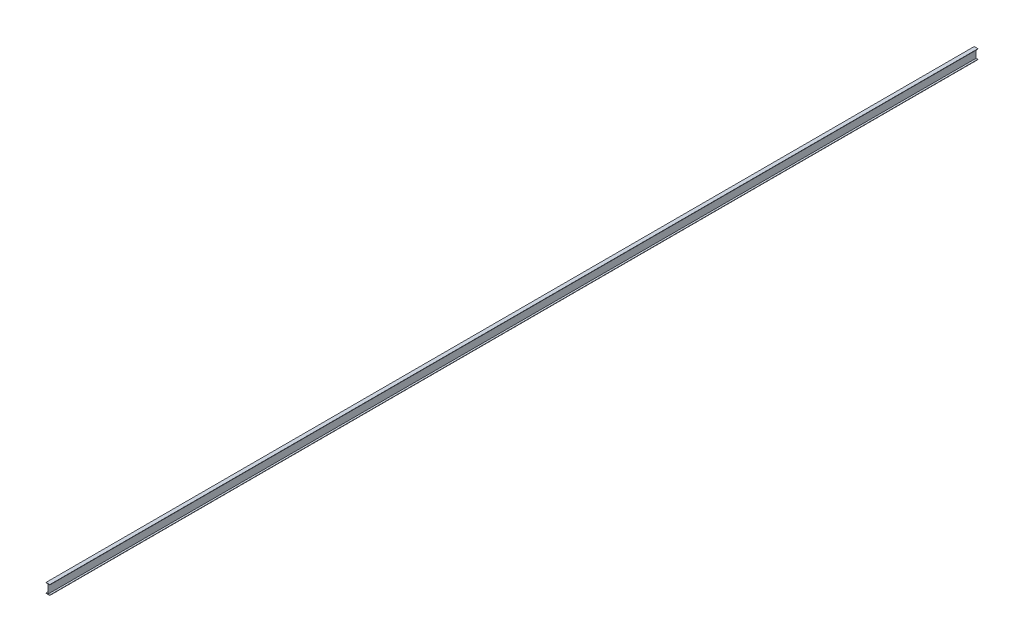
ISO-10303-21;
HEADER;
FILE_DESCRIPTION(('STEP AP214'),'2;1');
FILE_NAME('part.step','',(''),(''),'','','');
FILE_SCHEMA(('AUTOMOTIVE_DESIGN { 1 0 10303 214 1 1 1 1 }'));
ENDSEC;
DATA;
#1=APPLICATION_CONTEXT('core data for automotive mechanical design processes');
#2=APPLICATION_PROTOCOL_DEFINITION('international standard','automotive_design',2000,#1);
#3=PRODUCT_CONTEXT('',#1,'mechanical');
#4=PRODUCT('Part','Part','',(#3));
#5=PRODUCT_RELATED_PRODUCT_CATEGORY('part','',(#4));
#6=PRODUCT_DEFINITION_FORMATION('','',#4);
#7=PRODUCT_DEFINITION_CONTEXT('part definition',#1,'design');
#8=PRODUCT_DEFINITION('design','',#6,#7);
#9=PRODUCT_DEFINITION_SHAPE('','',#8);
#10=(LENGTH_UNIT() NAMED_UNIT(*) SI_UNIT(.MILLI.,.METRE.));
#11=(NAMED_UNIT(*) PLANE_ANGLE_UNIT() SI_UNIT($,.RADIAN.));
#12=(NAMED_UNIT(*) SI_UNIT($,.STERADIAN.) SOLID_ANGLE_UNIT());
#13=UNCERTAINTY_MEASURE_WITH_UNIT(LENGTH_MEASURE(1.E-05),#10,'distance_accuracy_value','');
#14=(GEOMETRIC_REPRESENTATION_CONTEXT(3) GLOBAL_UNCERTAINTY_ASSIGNED_CONTEXT((#13)) GLOBAL_UNIT_ASSIGNED_CONTEXT((#10,
#11,#12)) REPRESENTATION_CONTEXT('',''));
#15=CARTESIAN_POINT('',(0.,0.,0.));
#16=DIRECTION('',(0.,0.,1.));
#17=DIRECTION('',(1.,0.,0.));
#18=AXIS2_PLACEMENT_3D('',#15,#16,#17);
#19=CARTESIAN_POINT('',(-5.09961799999981,484.000002894462,49152.));
#20=DIRECTION('',(1.,0.,0.));
#21=DIRECTION('',(0.,1.,0.));
#22=AXIS2_PLACEMENT_3D('',#19,#20,#21);
#23=PLANE('',#22);
#24=DIRECTION('',(0.,-1.,0.));
#25=VECTOR('',#24,1.);
#26=CARTESIAN_POINT('',(-5.09961799999981,484.000002894462,0.));
#27=LINE('',#26,#25);
#28=CARTESIAN_POINT('',(-5.09961799999981,484.000002894462,0.));
#29=VERTEX_POINT('',#28);
#30=CARTESIAN_POINT('',(-5.09961799999979,16.,0.));
#31=VERTEX_POINT('',#30);
#32=EDGE_CURVE('E153',#29,#31,#27,.T.);
#33=ORIENTED_EDGE('',*,*,#32,.T.);
#34=DIRECTION('',(0.,0.,-1.));
#35=VECTOR('',#34,1.);
#36=CARTESIAN_POINT('',(-5.09961799999979,16.,49152.));
#37=LINE('',#36,#35);
#38=CARTESIAN_POINT('',(-5.09961799999979,16.,49152.));
#39=VERTEX_POINT('',#38);
#40=EDGE_CURVE('E11',#39,#31,#37,.T.);
#41=ORIENTED_EDGE('',*,*,#40,.F.);
#42=DIRECTION('',(0.,-1.,0.));
#43=VECTOR('',#42,1.);
#44=CARTESIAN_POINT('',(-5.09961799999981,484.000002894462,49152.));
#45=LINE('',#44,#43);
#46=CARTESIAN_POINT('',(-5.09961799999981,484.000002894462,49152.));
#47=VERTEX_POINT('',#46);
#48=EDGE_CURVE('E175',#47,#39,#45,.T.);
#49=ORIENTED_EDGE('',*,*,#48,.F.);
#50=DIRECTION('',(0.,0.,-1.));
#51=VECTOR('',#50,1.);
#52=CARTESIAN_POINT('',(-5.09961799999981,484.000002894462,49152.));
#53=LINE('',#52,#51);
#54=EDGE_CURVE('E149',#47,#29,#53,.T.);
#55=ORIENTED_EDGE('',*,*,#54,.T.);
#56=EDGE_LOOP('',(#33,#41,#49,#55));
#57=FACE_BOUND('',#56,.T.);
#58=ADVANCED_FACE('F33',(#57),#23,.F.);
#59=CARTESIAN_POINT('',(-99.9999999999999,16.,49152.));
#60=DIRECTION('',(0.,-1.,0.));
#61=DIRECTION('',(1.,0.,0.));
#62=AXIS2_PLACEMENT_3D('',#59,#60,#61);
#63=PLANE('',#62);
#64=DIRECTION('',(-1.,0.,0.));
#65=VECTOR('',#64,1.);
#66=CARTESIAN_POINT('',(-99.9999999999999,16.,0.));
#67=LINE('',#66,#65);
#68=CARTESIAN_POINT('',(-99.9999999999999,16.,0.));
#69=VERTEX_POINT('',#68);
#70=EDGE_CURVE('E156',#31,#69,#67,.T.);
#71=ORIENTED_EDGE('',*,*,#70,.T.);
#72=DIRECTION('',(0.,0.,-1.));
#73=VECTOR('',#72,1.);
#74=CARTESIAN_POINT('',(-99.9999999999999,16.,49152.));
#75=LINE('',#74,#73);
#76=CARTESIAN_POINT('',(-99.9999999999999,16.,49152.));
#77=VERTEX_POINT('',#76);
#78=EDGE_CURVE('E41',#77,#69,#75,.T.);
#79=ORIENTED_EDGE('',*,*,#78,.F.);
#80=DIRECTION('',(-1.,0.,0.));
#81=VECTOR('',#80,1.);
#82=CARTESIAN_POINT('',(-99.9999999999999,16.,49152.));
#83=LINE('',#82,#81);
#84=EDGE_CURVE('E104',#39,#77,#83,.T.);
#85=ORIENTED_EDGE('',*,*,#84,.F.);
#86=ORIENTED_EDGE('',*,*,#40,.T.);
#87=EDGE_LOOP('',(#71,#79,#85,#86));
#88=FACE_BOUND('',#87,.T.);
#89=ADVANCED_FACE('F253',(#88),#63,.F.);
#90=CARTESIAN_POINT('',(-99.9999999999999,0.,49152.));
#91=DIRECTION('',(1.,0.,0.));
#92=DIRECTION('',(0.,0.,-1.));
#93=AXIS2_PLACEMENT_3D('',#90,#91,#92);
#94=PLANE('',#93);
#95=DIRECTION('',(0.,-1.,0.));
#96=VECTOR('',#95,1.);
#97=CARTESIAN_POINT('',(-99.9999999999999,0.,0.));
#98=LINE('',#97,#96);
#99=CARTESIAN_POINT('',(-99.9999999999999,0.,0.));
#100=VERTEX_POINT('',#99);
#101=EDGE_CURVE('E158',#69,#100,#98,.T.);
#102=ORIENTED_EDGE('',*,*,#101,.T.);
#103=DIRECTION('',(0.,0.,-1.));
#104=VECTOR('',#103,1.);
#105=CARTESIAN_POINT('',(-99.9999999999999,0.,49152.));
#106=LINE('',#105,#104);
#107=CARTESIAN_POINT('',(-99.9999999999999,0.,49152.));
#108=VERTEX_POINT('',#107);
#109=EDGE_CURVE('E194',#108,#100,#106,.T.);
#110=ORIENTED_EDGE('',*,*,#109,.F.);
#111=DIRECTION('',(0.,-1.,0.));
#112=VECTOR('',#111,1.);
#113=CARTESIAN_POINT('',(-99.9999999999999,0.,49152.));
#114=LINE('',#113,#112);
#115=EDGE_CURVE('E202',#77,#108,#114,.T.);
#116=ORIENTED_EDGE('',*,*,#115,.F.);
#117=ORIENTED_EDGE('',*,*,#78,.T.);
#118=EDGE_LOOP('',(#102,#110,#116,#117));
#119=FACE_BOUND('',#118,.T.);
#120=ADVANCED_FACE('F200',(#119),#94,.F.);
#121=CARTESIAN_POINT('',(-99.9999999999999,0.,49152.));
#122=DIRECTION('',(0.,1.,0.));
#123=DIRECTION('',(0.,0.,1.));
#124=AXIS2_PLACEMENT_3D('',#121,#122,#123);
#125=PLANE('',#124);
#126=DIRECTION('',(1.,0.,0.));
#127=VECTOR('',#126,1.);
#128=CARTESIAN_POINT('',(-99.9999999999999,0.,0.));
#129=LINE('',#128,#127);
#130=CARTESIAN_POINT('',(99.9999999999999,0.,0.));
#131=VERTEX_POINT('',#130);
#132=EDGE_CURVE('E160',#100,#131,#129,.T.);
#133=ORIENTED_EDGE('',*,*,#132,.T.);
#134=DIRECTION('',(0.,0.,-1.));
#135=VECTOR('',#134,1.);
#136=CARTESIAN_POINT('',(99.9999999999999,0.,49152.));
#137=LINE('',#136,#135);
#138=CARTESIAN_POINT('',(99.9999999999999,0.,49152.));
#139=VERTEX_POINT('',#138);
#140=EDGE_CURVE('E191',#139,#131,#137,.T.);
#141=ORIENTED_EDGE('',*,*,#140,.F.);
#142=DIRECTION('',(1.,0.,0.));
#143=VECTOR('',#142,1.);
#144=CARTESIAN_POINT('',(-99.9999999999999,0.,49152.));
#145=LINE('',#144,#143);
#146=EDGE_CURVE('E220',#108,#139,#145,.T.);
#147=ORIENTED_EDGE('',*,*,#146,.F.);
#148=ORIENTED_EDGE('',*,*,#109,.T.);
#149=EDGE_LOOP('',(#133,#141,#147,#148));
#150=FACE_BOUND('',#149,.T.);
#151=ADVANCED_FACE('F211',(#150),#125,.F.);
#152=CARTESIAN_POINT('',(99.9999999999999,0.,49152.));
#153=DIRECTION('',(-1.,0.,0.));
#154=DIRECTION('',(0.,0.,1.));
#155=AXIS2_PLACEMENT_3D('',#152,#153,#154);
#156=PLANE('',#155);
#157=DIRECTION('',(0.,1.,0.));
#158=VECTOR('',#157,1.);
#159=CARTESIAN_POINT('',(99.9999999999999,0.,0.));
#160=LINE('',#159,#158);
#161=CARTESIAN_POINT('',(99.9999999999999,16.,0.));
#162=VERTEX_POINT('',#161);
#163=EDGE_CURVE('E162',#131,#162,#160,.T.);
#164=ORIENTED_EDGE('',*,*,#163,.T.);
#165=DIRECTION('',(0.,0.,-1.));
#166=VECTOR('',#165,1.);
#167=CARTESIAN_POINT('',(99.9999999999999,16.,49152.));
#168=LINE('',#167,#166);
#169=CARTESIAN_POINT('',(99.9999999999999,16.,49152.));
#170=VERTEX_POINT('',#169);
#171=EDGE_CURVE('E188',#170,#162,#168,.T.);
#172=ORIENTED_EDGE('',*,*,#171,.F.);
#173=DIRECTION('',(0.,1.,0.));
#174=VECTOR('',#173,1.);
#175=CARTESIAN_POINT('',(99.9999999999999,0.,49152.));
#176=LINE('',#175,#174);
#177=EDGE_CURVE('E217',#139,#170,#176,.T.);
#178=ORIENTED_EDGE('',*,*,#177,.F.);
#179=ORIENTED_EDGE('',*,*,#140,.T.);
#180=EDGE_LOOP('',(#164,#172,#178,#179));
#181=FACE_BOUND('',#180,.T.);
#182=ADVANCED_FACE('F215',(#181),#156,.F.);
#183=CARTESIAN_POINT('',(5.10000000000033,16.,49152.));
#184=DIRECTION('',(0.,-1.,0.));
#185=DIRECTION('',(0.,0.,-1.));
#186=AXIS2_PLACEMENT_3D('',#183,#184,#185);
#187=PLANE('',#186);
#188=DIRECTION('',(-1.,0.,0.));
#189=VECTOR('',#188,1.);
#190=CARTESIAN_POINT('',(5.10000000000033,16.,0.));
#191=LINE('',#190,#189);
#192=CARTESIAN_POINT('',(5.10000000000033,16.,0.));
#193=VERTEX_POINT('',#192);
#194=EDGE_CURVE('E164',#162,#193,#191,.T.);
#195=ORIENTED_EDGE('',*,*,#194,.T.);
#196=DIRECTION('',(0.,0.,-1.));
#197=VECTOR('',#196,1.);
#198=CARTESIAN_POINT('',(5.10000000000033,16.,49152.));
#199=LINE('',#198,#197);
#200=CARTESIAN_POINT('',(5.10000000000033,16.,49152.));
#201=VERTEX_POINT('',#200);
#202=EDGE_CURVE('E185',#201,#193,#199,.T.);
#203=ORIENTED_EDGE('',*,*,#202,.F.);
#204=DIRECTION('',(-1.,0.,0.));
#205=VECTOR('',#204,1.);
#206=CARTESIAN_POINT('',(5.10000000000033,16.,49152.));
#207=LINE('',#206,#205);
#208=EDGE_CURVE('E219',#170,#201,#207,.T.);
#209=ORIENTED_EDGE('',*,*,#208,.F.);
#210=ORIENTED_EDGE('',*,*,#171,.T.);
#211=EDGE_LOOP('',(#195,#203,#209,#210));
#212=FACE_BOUND('',#211,.T.);
#213=ADVANCED_FACE('F266',(#212),#187,.F.);
#214=CARTESIAN_POINT('',(5.10000000000033,16.,49152.));
#215=DIRECTION('',(-1.,0.,0.));
#216=DIRECTION('',(0.,-1.,0.));
#217=AXIS2_PLACEMENT_3D('',#214,#215,#216);
#218=PLANE('',#217);
#219=DIRECTION('',(0.,1.,0.));
#220=VECTOR('',#219,1.);
#221=CARTESIAN_POINT('',(5.10000000000033,16.,0.));
#222=LINE('',#221,#220);
#223=CARTESIAN_POINT('',(5.10000000000033,484.00000320555,0.));
#224=VERTEX_POINT('',#223);
#225=EDGE_CURVE('E166',#193,#224,#222,.T.);
#226=ORIENTED_EDGE('',*,*,#225,.T.);
#227=DIRECTION('',(0.,0.,-1.));
#228=VECTOR('',#227,1.);
#229=CARTESIAN_POINT('',(5.10000000000033,484.00000320555,49152.));
#230=LINE('',#229,#228);
#231=CARTESIAN_POINT('',(5.10000000000033,484.00000320555,49152.));
#232=VERTEX_POINT('',#231);
#233=EDGE_CURVE('E182',#232,#224,#230,.T.);
#234=ORIENTED_EDGE('',*,*,#233,.F.);
#235=DIRECTION('',(0.,1.,0.));
#236=VECTOR('',#235,1.);
#237=CARTESIAN_POINT('',(5.10000000000033,16.,49152.));
#238=LINE('',#237,#236);
#239=EDGE_CURVE('E222',#201,#232,#238,.T.);
#240=ORIENTED_EDGE('',*,*,#239,.F.);
#241=ORIENTED_EDGE('',*,*,#202,.T.);
#242=EDGE_LOOP('',(#226,#234,#240,#241));
#243=FACE_BOUND('',#242,.T.);
#244=ADVANCED_FACE('F269',(#243),#218,.F.);
#245=CARTESIAN_POINT('',(5.10000000000033,484.00000320555,49152.));
#246=DIRECTION('',(-3.05000001370114E-08,1.,0.));
#247=DIRECTION('',(-1.,-3.05000001370114E-08,0.));
#248=AXIS2_PLACEMENT_3D('',#245,#246,#247);
#249=PLANE('',#248);
#250=DIRECTION('',(0.999999999999999,3.05000001370114E-08,0.));
#251=VECTOR('',#250,1.);
#252=CARTESIAN_POINT('',(5.10000000000033,484.00000320555,0.));
#253=LINE('',#252,#251);
#254=CARTESIAN_POINT('',(99.9999999999999,484.0000061,0.));
#255=VERTEX_POINT('',#254);
#256=EDGE_CURVE('E168',#224,#255,#253,.T.);
#257=ORIENTED_EDGE('',*,*,#256,.T.);
#258=DIRECTION('',(0.,0.,-1.));
#259=VECTOR('',#258,1.);
#260=CARTESIAN_POINT('',(99.9999999999999,484.0000061,49152.));
#261=LINE('',#260,#259);
#262=CARTESIAN_POINT('',(99.9999999999999,484.0000061,49152.));
#263=VERTEX_POINT('',#262);
#264=EDGE_CURVE('E179',#263,#255,#261,.T.);
#265=ORIENTED_EDGE('',*,*,#264,.F.);
#266=DIRECTION('',(0.999999999999999,3.05000001370114E-08,0.));
#267=VECTOR('',#266,1.);
#268=CARTESIAN_POINT('',(5.10000000000033,484.00000320555,49152.));
#269=LINE('',#268,#267);
#270=EDGE_CURVE('E228',#232,#263,#269,.T.);
#271=ORIENTED_EDGE('',*,*,#270,.F.);
#272=ORIENTED_EDGE('',*,*,#233,.T.);
#273=EDGE_LOOP('',(#257,#265,#271,#272));
#274=FACE_BOUND('',#273,.T.);
#275=ADVANCED_FACE('F234',(#274),#249,.F.);
#276=CARTESIAN_POINT('',(99.9999999999999,484.0000061,49152.));
#277=DIRECTION('',(-1.,0.,0.));
#278=DIRECTION('',(0.,0.,1.));
#279=AXIS2_PLACEMENT_3D('',#276,#277,#278);
#280=PLANE('',#279);
#281=DIRECTION('',(0.,1.,0.));
#282=VECTOR('',#281,1.);
#283=CARTESIAN_POINT('',(99.9999999999999,484.0000061,0.));
#284=LINE('',#283,#282);
#285=CARTESIAN_POINT('',(99.9999999999999,500.,0.));
#286=VERTEX_POINT('',#285);
#287=EDGE_CURVE('E170',#255,#286,#284,.T.);
#288=ORIENTED_EDGE('',*,*,#287,.T.);
#289=DIRECTION('',(0.,0.,-1.));
#290=VECTOR('',#289,1.);
#291=CARTESIAN_POINT('',(99.9999999999999,500.,49152.));
#292=LINE('',#291,#290);
#293=CARTESIAN_POINT('',(99.9999999999999,500.,49152.));
#294=VERTEX_POINT('',#293);
#295=EDGE_CURVE('E144',#294,#286,#292,.T.);
#296=ORIENTED_EDGE('',*,*,#295,.F.);
#297=DIRECTION('',(0.,1.,0.));
#298=VECTOR('',#297,1.);
#299=CARTESIAN_POINT('',(99.9999999999999,484.0000061,49152.));
#300=LINE('',#299,#298);
#301=EDGE_CURVE('E135',#263,#294,#300,.T.);
#302=ORIENTED_EDGE('',*,*,#301,.F.);
#303=ORIENTED_EDGE('',*,*,#264,.T.);
#304=EDGE_LOOP('',(#288,#296,#302,#303));
#305=FACE_BOUND('',#304,.T.);
#306=ADVANCED_FACE('F238',(#305),#280,.F.);
#307=CARTESIAN_POINT('',(-99.9999999999999,500.,49152.));
#308=DIRECTION('',(0.,-1.,0.));
#309=DIRECTION('',(0.,0.,-1.));
#310=AXIS2_PLACEMENT_3D('',#307,#308,#309);
#311=PLANE('',#310);
#312=DIRECTION('',(-1.,0.,0.));
#313=VECTOR('',#312,1.);
#314=CARTESIAN_POINT('',(-99.9999999999999,500.,0.));
#315=LINE('',#314,#313);
#316=CARTESIAN_POINT('',(-99.9999999999999,500.,0.));
#317=VERTEX_POINT('',#316);
#318=EDGE_CURVE('E143',#286,#317,#315,.T.);
#319=ORIENTED_EDGE('',*,*,#318,.T.);
#320=DIRECTION('',(0.,0.,-1.));
#321=VECTOR('',#320,1.);
#322=CARTESIAN_POINT('',(-99.9999999999999,500.,49152.));
#323=LINE('',#322,#321);
#324=CARTESIAN_POINT('',(-99.9999999999999,500.,49152.));
#325=VERTEX_POINT('',#324);
#326=EDGE_CURVE('E140',#325,#317,#323,.T.);
#327=ORIENTED_EDGE('',*,*,#326,.F.);
#328=DIRECTION('',(-1.,0.,0.));
#329=VECTOR('',#328,1.);
#330=CARTESIAN_POINT('',(-99.9999999999999,500.,49152.));
#331=LINE('',#330,#329);
#332=EDGE_CURVE('E129',#294,#325,#331,.T.);
#333=ORIENTED_EDGE('',*,*,#332,.F.);
#334=ORIENTED_EDGE('',*,*,#295,.T.);
#335=EDGE_LOOP('',(#319,#327,#333,#334));
#336=FACE_BOUND('',#335,.T.);
#337=ADVANCED_FACE('F141',(#336),#311,.F.);
#338=CARTESIAN_POINT('',(-99.9999999999999,500.,49152.));
#339=DIRECTION('',(1.,0.,0.));
#340=DIRECTION('',(0.,0.,-1.));
#341=AXIS2_PLACEMENT_3D('',#338,#339,#340);
#342=PLANE('',#341);
#343=DIRECTION('',(0.,-1.,0.));
#344=VECTOR('',#343,1.);
#345=CARTESIAN_POINT('',(-99.9999999999999,500.,0.));
#346=LINE('',#345,#344);
#347=CARTESIAN_POINT('',(-99.9999999999999,484.,0.));
#348=VERTEX_POINT('',#347);
#349=EDGE_CURVE('E90',#317,#348,#346,.T.);
#350=ORIENTED_EDGE('',*,*,#349,.T.);
#351=DIRECTION('',(0.,0.,-1.));
#352=VECTOR('',#351,1.);
#353=CARTESIAN_POINT('',(-99.9999999999999,484.,49152.));
#354=LINE('',#353,#352);
#355=CARTESIAN_POINT('',(-99.9999999999999,484.,49152.));
#356=VERTEX_POINT('',#355);
#357=EDGE_CURVE('E145',#356,#348,#354,.T.);
#358=ORIENTED_EDGE('',*,*,#357,.F.);
#359=DIRECTION('',(0.,-1.,0.));
#360=VECTOR('',#359,1.);
#361=CARTESIAN_POINT('',(-99.9999999999999,500.,49152.));
#362=LINE('',#361,#360);
#363=EDGE_CURVE('E133',#325,#356,#362,.T.);
#364=ORIENTED_EDGE('',*,*,#363,.F.);
#365=ORIENTED_EDGE('',*,*,#326,.T.);
#366=EDGE_LOOP('',(#350,#358,#364,#365));
#367=FACE_BOUND('',#366,.T.);
#368=ADVANCED_FACE('F147',(#367),#342,.F.);
#369=CARTESIAN_POINT('',(-99.9999999999999,484.,49152.));
#370=DIRECTION('',(-3.05000002038361E-08,1.,0.));
#371=DIRECTION('',(-1.,-3.05000002038361E-08,0.));
#372=AXIS2_PLACEMENT_3D('',#369,#370,#371);
#373=PLANE('',#372);
#374=DIRECTION('',(1.,3.05000002038361E-08,0.));
#375=VECTOR('',#374,1.);
#376=CARTESIAN_POINT('',(-99.9999999999999,484.,0.));
#377=LINE('',#376,#375);
#378=EDGE_CURVE('E96',#348,#29,#377,.T.);
#379=ORIENTED_EDGE('',*,*,#378,.T.);
#380=ORIENTED_EDGE('',*,*,#54,.F.);
#381=DIRECTION('',(1.,3.05000002038361E-08,0.));
#382=VECTOR('',#381,1.);
#383=CARTESIAN_POINT('',(-99.9999999999999,484.,49152.));
#384=LINE('',#383,#382);
#385=EDGE_CURVE('E49',#356,#47,#384,.T.);
#386=ORIENTED_EDGE('',*,*,#385,.F.);
#387=ORIENTED_EDGE('',*,*,#357,.T.);
#388=EDGE_LOOP('',(#379,#380,#386,#387));
#389=FACE_BOUND('',#388,.T.);
#390=ADVANCED_FACE('F242',(#389),#373,.F.);
#391=CARTESIAN_POINT('',(-5.09961799999979,16.,49152.));
#392=DIRECTION('',(0.,0.,1.));
#393=DIRECTION('',(1.,0.,0.));
#394=AXIS2_PLACEMENT_3D('',#391,#392,#393);
#395=PLANE('',#394);
#396=ORIENTED_EDGE('',*,*,#48,.T.);
#397=ORIENTED_EDGE('',*,*,#84,.T.);
#398=ORIENTED_EDGE('',*,*,#115,.T.);
#399=ORIENTED_EDGE('',*,*,#146,.T.);
#400=ORIENTED_EDGE('',*,*,#177,.T.);
#401=ORIENTED_EDGE('',*,*,#208,.T.);
#402=ORIENTED_EDGE('',*,*,#239,.T.);
#403=ORIENTED_EDGE('',*,*,#270,.T.);
#404=ORIENTED_EDGE('',*,*,#301,.T.);
#405=ORIENTED_EDGE('',*,*,#332,.T.);
#406=ORIENTED_EDGE('',*,*,#363,.T.);
#407=ORIENTED_EDGE('',*,*,#385,.T.);
#408=EDGE_LOOP('',(#396,#397,#398,#399,#400,#401,#402,#403,#404,#405,#406,#407));
#409=FACE_BOUND('',#408,.T.);
#410=ADVANCED_FACE('F131',(#409),#395,.T.);
#411=CARTESIAN_POINT('',(-5.09961799999979,16.,0.));
#412=DIRECTION('',(0.,0.,1.));
#413=DIRECTION('',(1.,0.,0.));
#414=AXIS2_PLACEMENT_3D('',#411,#412,#413);
#415=PLANE('',#414);
#416=ORIENTED_EDGE('',*,*,#32,.F.);
#417=ORIENTED_EDGE('',*,*,#378,.F.);
#418=ORIENTED_EDGE('',*,*,#349,.F.);
#419=ORIENTED_EDGE('',*,*,#318,.F.);
#420=ORIENTED_EDGE('',*,*,#287,.F.);
#421=ORIENTED_EDGE('',*,*,#256,.F.);
#422=ORIENTED_EDGE('',*,*,#225,.F.);
#423=ORIENTED_EDGE('',*,*,#194,.F.);
#424=ORIENTED_EDGE('',*,*,#163,.F.);
#425=ORIENTED_EDGE('',*,*,#132,.F.);
#426=ORIENTED_EDGE('',*,*,#101,.F.);
#427=ORIENTED_EDGE('',*,*,#70,.F.);
#428=EDGE_LOOP('',(#416,#417,#418,#419,#420,#421,#422,#423,#424,#425,#426,#427));
#429=FACE_BOUND('',#428,.T.);
#430=ADVANCED_FACE('F206',(#429),#415,.F.);
#431=CLOSED_SHELL('',(#58,#89,#120,#151,#182,#213,#244,#275,#306,#337,#368,#390,#410,#430));
#432=MANIFOLD_SOLID_BREP('B2',#431);
#433=ADVANCED_BREP_SHAPE_REPRESENTATION('',(#18,#432),#14);
#434=SHAPE_DEFINITION_REPRESENTATION(#9,#433);
ENDSEC;
END-ISO-10303-21;
